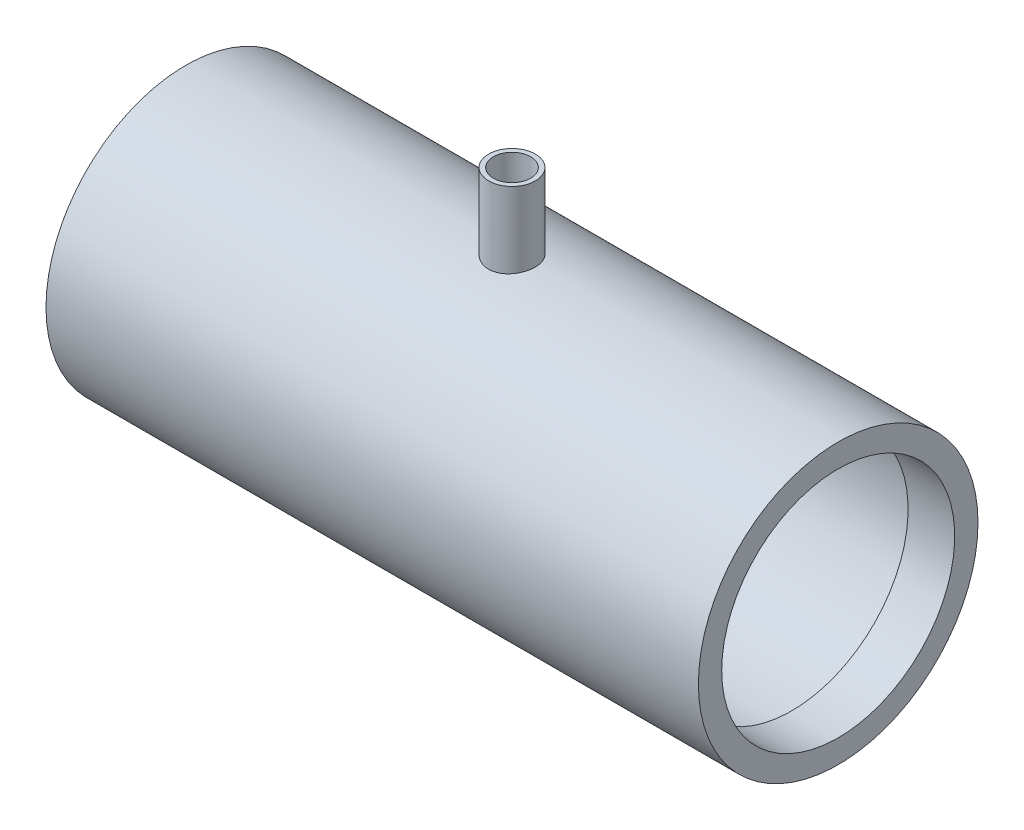
ISO-10303-21;
HEADER;
FILE_DESCRIPTION(('STEP AP214'),'2;1');
FILE_NAME('part.step','',(''),(''),'','','');
FILE_SCHEMA(('AUTOMOTIVE_DESIGN { 1 0 10303 214 1 1 1 1 }'));
ENDSEC;
DATA;
#1=APPLICATION_CONTEXT('core data for automotive mechanical design processes');
#2=APPLICATION_PROTOCOL_DEFINITION('international standard','automotive_design',2000,#1);
#3=PRODUCT_CONTEXT('',#1,'mechanical');
#4=PRODUCT('Part','Part','',(#3));
#5=PRODUCT_RELATED_PRODUCT_CATEGORY('part','',(#4));
#6=PRODUCT_DEFINITION_FORMATION('','',#4);
#7=PRODUCT_DEFINITION_CONTEXT('part definition',#1,'design');
#8=PRODUCT_DEFINITION('design','',#6,#7);
#9=PRODUCT_DEFINITION_SHAPE('','',#8);
#10=(LENGTH_UNIT() NAMED_UNIT(*) SI_UNIT(.MILLI.,.METRE.));
#11=(NAMED_UNIT(*) PLANE_ANGLE_UNIT() SI_UNIT($,.RADIAN.));
#12=(NAMED_UNIT(*) SI_UNIT($,.STERADIAN.) SOLID_ANGLE_UNIT());
#13=UNCERTAINTY_MEASURE_WITH_UNIT(LENGTH_MEASURE(1.E-05),#10,'distance_accuracy_value','');
#14=(GEOMETRIC_REPRESENTATION_CONTEXT(3) GLOBAL_UNCERTAINTY_ASSIGNED_CONTEXT((#13)) GLOBAL_UNIT_ASSIGNED_CONTEXT((#10,
#11,#12)) REPRESENTATION_CONTEXT('',''));
#15=CARTESIAN_POINT('',(0.,0.,0.));
#16=DIRECTION('',(0.,0.,1.));
#17=DIRECTION('',(1.,0.,0.));
#18=AXIS2_PLACEMENT_3D('',#15,#16,#17);
#19=CARTESIAN_POINT('',(0.,35.,0.));
#20=DIRECTION('',(0.,-1.,0.));
#21=DIRECTION('',(0.,0.,-1.));
#22=AXIS2_PLACEMENT_3D('',#19,#20,#21);
#23=CYLINDRICAL_SURFACE('',#22,2.);
#24=CARTESIAN_POINT('',(0.,23.,0.));
#25=DIRECTION('',(0.,1.,0.));
#26=DIRECTION('',(0.,0.,1.));
#27=AXIS2_PLACEMENT_3D('',#24,#25,#26);
#28=CIRCLE('',#27,2.);
#29=CARTESIAN_POINT('',(0.,23.,2.));
#30=VERTEX_POINT('',#29);
#31=EDGE_CURVE('E118',#30,#30,#28,.F.);
#32=ORIENTED_EDGE('',*,*,#31,.F.);
#33=EDGE_LOOP('',(#32));
#34=FACE_BOUND('',#33,.T.);
#35=CARTESIAN_POINT('',(0.,13.856406460551,-2.));
#36=CARTESIAN_POINT('',(0.111724171239718,13.8564082571265,-1.99999534115949));
#37=CARTESIAN_POINT('',(0.223514712772157,13.8577723197261,-1.99060664506871));
#38=CARTESIAN_POINT('',(0.4439746364233,13.8630779913067,-1.95330740137887));
#39=CARTESIAN_POINT('',(0.552640795515153,13.8670221688303,-1.92537839621705));
#40=CARTESIAN_POINT('',(0.763628700028854,13.8770324264324,-1.85184738836467));
#41=CARTESIAN_POINT('',(0.865955078100517,13.8830969350759,-1.80625847122079));
#42=CARTESIAN_POINT('',(1.06148972946806,13.8966626659811,-1.69873175889211));
#43=CARTESIAN_POINT('',(1.15469934704029,13.9041636759451,-1.63679637900725));
#44=CARTESIAN_POINT('',(1.33004829584733,13.9198182525555,-1.49785346840196));
#45=CARTESIAN_POINT('',(1.41211171386589,13.9279757447273,-1.42075056427329));
#46=CARTESIAN_POINT('',(1.56218155724058,13.9439890311844,-1.25386707896715));
#47=CARTESIAN_POINT('',(1.63018723264027,13.9518448093556,-1.16408582185113));
#48=CARTESIAN_POINT('',(1.75048909775968,13.9664103702289,-0.973910384020492));
#49=CARTESIAN_POINT('',(1.80271571451843,13.9731150229347,-0.873471766216093));
#50=CARTESIAN_POINT('',(1.88953073532782,13.9845795145291,-0.665136745963097));
#51=CARTESIAN_POINT('',(1.92411998664739,13.9893394468365,-0.55724070203933));
#52=CARTESIAN_POINT('',(1.97444920696427,13.9963505000898,-0.337834063540951));
#53=CARTESIAN_POINT('',(1.99031606996624,13.9986185031811,-0.226353125069878));
#54=CARTESIAN_POINT('',(2.0031438985666,14.0004479548383,-0.00228956527839937));
#55=CARTESIAN_POINT('',(2.00010582196611,14.0000095405223,0.110292999940578));
#56=CARTESIAN_POINT('',(1.97531062178419,13.9964890946326,0.33249899218587));
#57=CARTESIAN_POINT('',(1.95369000111749,13.9934263413243,0.442137999771035));
#58=CARTESIAN_POINT('',(1.89255744030079,13.9850228541263,0.656215595128694));
#59=CARTESIAN_POINT('',(1.8530450750122,13.9796820661069,0.760654059261883));
#60=CARTESIAN_POINT('',(1.75710925521643,13.9672894037098,0.961781966767737));
#61=CARTESIAN_POINT('',(1.70062784888116,13.9602316817171,1.05844339279107));
#62=CARTESIAN_POINT('',(1.57239950725974,13.9451926669623,1.24096782013765));
#63=CARTESIAN_POINT('',(1.50065165935678,13.9372113189995,1.32683017541183));
#64=CARTESIAN_POINT('',(1.34316539832401,13.921132049438,1.48612299106386));
#65=CARTESIAN_POINT('',(1.25730786725081,13.9130337231123,1.55943569332184));
#66=CARTESIAN_POINT('',(1.07444547857052,13.8977029387566,1.69062989590123));
#67=CARTESIAN_POINT('',(0.977440563854387,13.8904704851631,1.74851131716179));
#68=CARTESIAN_POINT('',(0.774919710093822,13.8776905368292,1.84721301520795));
#69=CARTESIAN_POINT('',(0.669398194117397,13.8721441576987,1.88802200251778));
#70=CARTESIAN_POINT('',(0.452902420174113,13.8633846580895,1.9513062370832));
#71=CARTESIAN_POINT('',(0.341928509608439,13.8601713891613,1.97378265080303));
#72=CARTESIAN_POINT('',(0.118723462569961,13.8564698075732,1.99960390688194));
#73=CARTESIAN_POINT('',(0.00651197400441611,13.8559577720311,2.00311531104472));
#74=CARTESIAN_POINT('',(-0.216897805025151,13.8576537253271,1.99134808247121));
#75=CARTESIAN_POINT('',(-0.328096123823289,13.8598616378631,1.9760699768337));
#76=CARTESIAN_POINT('',(-0.545812180028447,13.8667269652516,1.92729837855201));
#77=CARTESIAN_POINT('',(-0.652348727065342,13.8713733134525,1.89388715844421));
#78=CARTESIAN_POINT('',(-0.858308797456497,13.8825829121217,1.80988306171463));
#79=CARTESIAN_POINT('',(-0.957731999561724,13.8891462490961,1.75928940970141));
#80=CARTESIAN_POINT('',(-1.14739187972149,13.9035064841342,1.64195360331226));
#81=CARTESIAN_POINT('',(-1.23756096121236,13.911311524523,1.57510320027125));
#82=CARTESIAN_POINT('',(-1.40545972362551,13.9272509086593,1.42730277821365));
#83=CARTESIAN_POINT('',(-1.48318876805913,13.9353852692295,1.34635203820216));
#84=CARTESIAN_POINT('',(-1.6245952184338,13.9511405241391,1.17191708628535));
#85=CARTESIAN_POINT('',(-1.68816252231952,13.9587570956185,1.07834317212433));
#86=CARTESIAN_POINT('',(-1.79867556313572,13.972552215598,0.881748704771193));
#87=CARTESIAN_POINT('',(-1.84562171973795,13.9787308004049,0.778728390176454));
#88=CARTESIAN_POINT('',(-1.92138211431572,13.9889347784444,0.566515924593931));
#89=CARTESIAN_POINT('',(-1.95025758862749,13.9929674365722,0.457345999123927));
#90=CARTESIAN_POINT('',(-1.98925546710661,13.9984555911653,0.235645259045784));
#91=CARTESIAN_POINT('',(-1.99937898985385,13.9999112413524,0.123114645314277));
#92=CARTESIAN_POINT('',(-2.00056023894447,14.0000800767192,-0.101043130627158));
#93=CARTESIAN_POINT('',(-1.99178681901844,13.998817550224,-0.212669421750584));
#94=CARTESIAN_POINT('',(-1.95578384995697,13.9937406427504,-0.432842633479872));
#95=CARTESIAN_POINT('',(-1.92855434439613,13.989926267797,-0.541389561355442));
#96=CARTESIAN_POINT('',(-1.85647002257181,13.9801722205426,-0.752283714497251));
#97=CARTESIAN_POINT('',(-1.81162581951526,13.9742338281967,-0.854634630206984));
#98=CARTESIAN_POINT('',(-1.70560285079797,13.9608856010229,-1.05038570585148));
#99=CARTESIAN_POINT('',(-1.64442365494189,13.9534757274438,-1.14378562996655));
#100=CARTESIAN_POINT('',(-1.50685228477663,13.9379304746346,-1.31984194960265));
#101=CARTESIAN_POINT('',(-1.4303350931675,13.9297894585903,-1.40240016631986));
#102=CARTESIAN_POINT('',(-1.2645224397647,13.9137422342621,-1.55356716727243));
#103=CARTESIAN_POINT('',(-1.17522397700347,13.9058360816507,-1.6221726663073));
#104=CARTESIAN_POINT('',(-0.985854561664355,13.8911108785174,-1.74379523475593));
#105=CARTESIAN_POINT('',(-0.885731309588877,13.8842975402726,-1.79673154300995));
#106=CARTESIAN_POINT('',(-0.67796770339548,13.8725962813595,-1.88495902507096));
#107=CARTESIAN_POINT('',(-0.57033540168281,13.8677063343816,-1.92026877922144));
#108=CARTESIAN_POINT('',(-0.385163574169462,13.8615529221772,-1.96409255165575));
#109=CARTESIAN_POINT('',(-0.308775664589437,13.859633039894,-1.97753762529532));
#110=CARTESIAN_POINT('',(-0.154935803034168,13.857059193163,-1.99549291508544));
#111=CARTESIAN_POINT('',(-0.0774838629538774,13.8564052145753,-2.00000323103726));
#112=CARTESIAN_POINT('',(0.,13.856406460551,-2.));
#113=B_SPLINE_CURVE_WITH_KNOTS('',3,(#35,#36,#37,#38,#39,#40,#41,#42,#43,#44,#45,#46,#47,#48,
#49,#50,#51,#52,#53,#54,#55,#56,#57,#58,#59,#60,#61,#62,#63,#64,#65,#66,#67,#68,#69,#70,#71,#72,
#73,#74,#75,#76,#77,#78,#79,#80,#81,#82,#83,#84,#85,#86,#87,#88,#89,#90,#91,#92,#93,#94,#95,#96,
#97,#98,#99,#100,#101,#102,#103,#104,#105,#106,#107,#108,#109,#110,#111,#112),.UNSPECIFIED.,.T.,
.F.,(4,2,2,2,2,2,2,2,2,2,2,2,2,2,2,2,2,2,2,2,2,2,2,2,2,2,2,2,2,2,2,2,2,2,2,2,2,2,4),(0.,
0.334889349408973,0.670112594526281,1.00508792139358,1.34001378108308,1.67711715649019,
2.01423851114537,2.35282530676003,2.6913958357102,3.02765822138618,3.36390357078099,
3.69769984907442,4.03150405935711,4.36646147641386,4.70143892261039,5.03940517986243,
5.37737316862278,5.7155642933107,6.05373389790875,6.3889286108256,6.72411392079906,
7.05779100804299,7.39148315513125,7.72746121011463,8.06345644976601,8.40197921522166,
8.74049343261658,9.07785422138908,9.41519488547502,9.74953375304065,10.083871831239,
10.4180087723112,10.7521545140199,11.0891434930866,11.426211725383,11.7649881551453,
12.103406718889,12.3356645196522,12.5679197260806),.UNSPECIFIED.);
#114=CARTESIAN_POINT('',(0.,13.856406460551,-2.));
#115=VERTEX_POINT('',#114);
#116=EDGE_CURVE('E44',#115,#115,#113,.T.);
#117=ORIENTED_EDGE('',*,*,#116,.T.);
#118=EDGE_LOOP('',(#117));
#119=FACE_BOUND('',#118,.T.);
#120=ADVANCED_FACE('F39',(#34,#119),#23,.F.);
#121=CARTESIAN_POINT('',(30.,0.,0.));
#122=DIRECTION('',(-1.,0.,0.));
#123=DIRECTION('',(0.,0.,1.));
#124=AXIS2_PLACEMENT_3D('',#121,#122,#123);
#125=CYLINDRICAL_SURFACE('',#124,15.);
#126=CARTESIAN_POINT('',(-35.,0.,0.));
#127=DIRECTION('',(-1.,0.,0.));
#128=DIRECTION('',(0.,0.,1.));
#129=AXIS2_PLACEMENT_3D('',#126,#127,#128);
#130=CIRCLE('',#129,15.);
#131=CARTESIAN_POINT('',(-35.,0.,15.));
#132=VERTEX_POINT('',#131);
#133=EDGE_CURVE('E58',#132,#132,#130,.T.);
#134=ORIENTED_EDGE('',*,*,#133,.F.);
#135=EDGE_LOOP('',(#134));
#136=FACE_BOUND('',#135,.T.);
#137=CARTESIAN_POINT('',(35.,0.,0.));
#138=DIRECTION('',(-1.,0.,0.));
#139=DIRECTION('',(0.,0.,1.));
#140=AXIS2_PLACEMENT_3D('',#137,#138,#139);
#141=CIRCLE('',#140,15.);
#142=CARTESIAN_POINT('',(35.,0.,15.));
#143=VERTEX_POINT('',#142);
#144=EDGE_CURVE('E129',#143,#143,#141,.T.);
#145=ORIENTED_EDGE('',*,*,#144,.T.);
#146=EDGE_LOOP('',(#145));
#147=FACE_BOUND('',#146,.T.);
#148=CARTESIAN_POINT('',(0.,14.790199457749,-2.5));
#149=CARTESIAN_POINT('',(-0.139375748161812,14.790201973666,-2.49999439841983));
#150=CARTESIAN_POINT('',(-0.278827606071472,14.7921909238523,-2.48830516902828));
#151=CARTESIAN_POINT('',(-0.553818543263169,14.7999245720004,-2.44187742806638));
#152=CARTESIAN_POINT('',(-0.689353893758065,14.8056727334637,-2.40711766030861));
#153=CARTESIAN_POINT('',(-0.952492283341606,14.8202560936731,-2.31562954367049));
#154=CARTESIAN_POINT('',(-1.08010184866225,14.8290887118401,-2.25891955493199));
#155=CARTESIAN_POINT('',(-1.32398095471777,14.8488427210228,-2.12518649688947));
#156=CARTESIAN_POINT('',(-1.44025176957733,14.8597638769423,-2.04816571350133));
#157=CARTESIAN_POINT('',(-1.65931284974456,14.8825847115588,-1.87518752696654));
#158=CARTESIAN_POINT('',(-1.76197513138622,14.8944921732795,-1.77906904893234));
#159=CARTESIAN_POINT('',(-1.94979330686181,14.9178748066858,-1.57097200469527));
#160=CARTESIAN_POINT('',(-2.03494816311542,14.9293499527174,-1.45899249914997));
#161=CARTESIAN_POINT('',(-2.18581456721927,14.9506573698271,-1.22152286994836));
#162=CARTESIAN_POINT('',(-2.2514070077318,14.9604794243234,-1.09595608145671));
#163=CARTESIAN_POINT('',(-2.36052107053055,14.9772873695709,-0.835395621723869));
#164=CARTESIAN_POINT('',(-2.40404412788488,14.9842734447266,-0.700402564078188));
#165=CARTESIAN_POINT('',(-2.4673925349839,14.994567347244,-0.426143726344243));
#166=CARTESIAN_POINT('',(-2.48743291600469,14.9979085311091,-0.286928886679271));
#167=CARTESIAN_POINT('',(-2.5039157541526,15.0006507934278,-0.00707528552579745));
#168=CARTESIAN_POINT('',(-2.50035981524723,15.0000521396931,0.133563378528898));
#169=CARTESIAN_POINT('',(-2.46991864847179,14.9950085843139,0.410802185078876));
#170=CARTESIAN_POINT('',(-2.44326483659085,14.990601836924,0.547428530700141));
#171=CARTESIAN_POINT('',(-2.36774892575351,14.9784797877164,0.814241979611791));
#172=CARTESIAN_POINT('',(-2.3188861504105,14.9707643851321,0.944428886651504));
#173=CARTESIAN_POINT('',(-2.20010935968468,14.9528269851196,1.19535614778265));
#174=CARTESIAN_POINT('',(-2.13009998791756,14.9425936732688,1.31605052301904));
#175=CARTESIAN_POINT('',(-1.97108717736495,14.920757380715,1.54406552984664));
#176=CARTESIAN_POINT('',(-1.88208220128918,14.9091542891913,1.65138507791588));
#177=CARTESIAN_POINT('',(-1.68632119338069,14.885702682326,1.85097127344667));
#178=CARTESIAN_POINT('',(-1.57936290509902,14.8738528973104,1.94303950225321));
#179=CARTESIAN_POINT('',(-1.35141290978418,14.8513795978481,2.10795458844807));
#180=CARTESIAN_POINT('',(-1.23042107331718,14.8407560947132,2.18080126853242));
#181=CARTESIAN_POINT('',(-0.97760835812252,14.8219375456182,2.30524443448829));
#182=CARTESIAN_POINT('',(-0.845775501907909,14.813745233026,2.35681702727924));
#183=CARTESIAN_POINT('',(-0.575150927692456,14.8007618868988,2.43702987081562));
#184=CARTESIAN_POINT('',(-0.436359823567576,14.7959705538832,2.46567214076796));
#185=CARTESIAN_POINT('',(-0.157533843837868,14.7903895942212,2.49893188487927));
#186=CARTESIAN_POINT('',(-0.017533620297898,14.7895528575867,2.50383220791244));
#187=CARTESIAN_POINT('',(0.26128667169082,14.7918503478236,2.49022270268246));
#188=CARTESIAN_POINT('',(0.400106785513972,14.7949844213185,2.47171377862467));
#189=CARTESIAN_POINT('',(0.671727759190858,14.8048268745502,2.4120523349281));
#190=CARTESIAN_POINT('',(0.80456113987801,14.8115125191835,2.37104379064639));
#191=CARTESIAN_POINT('',(1.06147016627949,14.827685730055,2.26769819019228));
#192=CARTESIAN_POINT('',(1.1855452875509,14.8371734639058,2.20535985810094));
#193=CARTESIAN_POINT('',(1.42267459440611,14.8579912839739,2.06045667322923));
#194=CARTESIAN_POINT('',(1.53561657275606,14.8693375560035,1.97771056415936));
#195=CARTESIAN_POINT('',(1.746113532695,14.8925466667987,1.79458946570798));
#196=CARTESIAN_POINT('',(1.84366743110974,14.9044095418533,1.69421323638404));
#197=CARTESIAN_POINT('',(2.0216518927287,14.9274642211826,1.47742807032881));
#198=CARTESIAN_POINT('',(2.10189382628454,14.9386477634467,1.3608632533862));
#199=CARTESIAN_POINT('',(2.24165532700488,14.9589511243294,1.11574344794933));
#200=CARTESIAN_POINT('',(2.30117556447385,14.9680710096998,0.987188847470626));
#201=CARTESIAN_POINT('',(2.39751058395487,14.9831835816958,0.722299051501327));
#202=CARTESIAN_POINT('',(2.43442407573492,14.9891898456762,0.58600056260261));
#203=CARTESIAN_POINT('',(2.48481559896383,14.9974558316928,0.30903073487421));
#204=CARTESIAN_POINT('',(2.49829555873235,14.9997158620019,0.168359756821619));
#205=CARTESIAN_POINT('',(2.5013818823122,15.0002303788781,-0.111541275773678));
#206=CARTESIAN_POINT('',(2.49127525394108,14.9985330202419,-0.250768160602666));
#207=CARTESIAN_POINT('',(2.44809607773057,14.9914217838733,-0.525511974314706));
#208=CARTESIAN_POINT('',(2.41502365849033,14.9860079269518,-0.66102892396748));
#209=CARTESIAN_POINT('',(2.32696183445635,14.972069888274,-0.924396445918537));
#210=CARTESIAN_POINT('',(2.27199683178995,14.9635491704088,-1.05225537215382));
#211=CARTESIAN_POINT('',(2.14174206376942,14.9443275687803,-1.29698045298217));
#212=CARTESIAN_POINT('',(2.06645133493755,14.9336265816741,-1.41384608611822));
#213=CARTESIAN_POINT('',(1.8966649075395,14.9110762961641,-1.6347129455264));
#214=CARTESIAN_POINT('',(1.80195904524874,14.8992152454112,-1.73855143060275));
#215=CARTESIAN_POINT('',(1.59647169209619,14.8757630331437,-1.92896387595091));
#216=CARTESIAN_POINT('',(1.48568644108747,14.8641719354951,-2.0155337867119));
#217=CARTESIAN_POINT('',(1.25025467751038,14.8424834353391,-2.16951427091086));
#218=CARTESIAN_POINT('',(1.12551566023451,14.8323971784578,-2.2367849890577));
#219=CARTESIAN_POINT('',(0.866390764161853,14.8149921009131,-2.34931453640427));
#220=CARTESIAN_POINT('',(0.732014677322635,14.8076705172488,-2.39459535522307));
#221=CARTESIAN_POINT('',(0.497596230512616,14.7982474485649,-2.45202605312742));
#222=CARTESIAN_POINT('',(0.398973192037393,14.7952462341947,-2.46998741767139));
#223=CARTESIAN_POINT('',(0.200246515163063,14.7912213528807,-2.49397629518131));
#224=CARTESIAN_POINT('',(0.100142903675801,14.7901976500369,-2.50000402479277));
#225=CARTESIAN_POINT('',(0.,14.790199457749,-2.5));
#226=B_SPLINE_CURVE_WITH_KNOTS('',3,(#148,#149,#150,#151,#152,#153,#154,#155,#156,#157,#158,
#159,#160,#161,#162,#163,#164,#165,#166,#167,#168,#169,#170,#171,#172,#173,#174,#175,#176,#177,
#178,#179,#180,#181,#182,#183,#184,#185,#186,#187,#188,#189,#190,#191,#192,#193,#194,#195,#196,
#197,#198,#199,#200,#201,#202,#203,#204,#205,#206,#207,#208,#209,#210,#211,#212,#213,#214,#215,
#216,#217,#218,#219,#220,#221,#222,#223,#224,#225),.UNSPECIFIED.,.T.,.F.,(4,2,2,2,2,2,2,2,2,2,2,
2,2,2,2,2,2,2,2,2,2,2,2,2,2,2,2,2,2,2,2,2,2,2,2,2,2,2,4),(0.,0.41776103892774,0.83590751996297,
1.25370499787519,1.67145547405274,2.09289159155715,2.51435267834447,2.93832980111435,
3.36227935111113,3.78231567472565,4.20232344652692,4.61817121164668,5.03403164249533,
5.45179604139425,5.86959426226764,6.29246123462124,6.71533210746019,7.13867662498604,
7.56198385938077,7.98023542420411,8.39847083413976,8.81406064635492,9.22967532293575,
9.64912342762702,10.0686010443069,10.4924411303538,10.916267504767,11.3382298441765,
11.7601574591235,12.1769777626592,12.5937957321882,13.0101503983246,13.4265248039234,
13.8476699746325,14.2689137888181,14.6931372761832,15.1169356674445,15.4171067054376,
15.7172722940182),.UNSPECIFIED.);
#227=CARTESIAN_POINT('',(0.,14.790199457749,-2.5));
#228=VERTEX_POINT('',#227);
#229=EDGE_CURVE('E10',#228,#228,#226,.T.);
#230=ORIENTED_EDGE('',*,*,#229,.F.);
#231=EDGE_LOOP('',(#230));
#232=FACE_BOUND('',#231,.T.);
#233=ADVANCED_FACE('F41',(#136,#147,#232),#125,.T.);
#234=CARTESIAN_POINT('',(30.,0.,0.));
#235=DIRECTION('',(-1.,0.,0.));
#236=DIRECTION('',(0.,0.,1.));
#237=AXIS2_PLACEMENT_3D('',#234,#235,#236);
#238=CYLINDRICAL_SURFACE('',#237,14.);
#239=CARTESIAN_POINT('',(30.,0.,0.));
#240=DIRECTION('',(1.,0.,0.));
#241=DIRECTION('',(0.,0.,-1.));
#242=AXIS2_PLACEMENT_3D('',#239,#240,#241);
#243=CIRCLE('',#242,14.);
#244=CARTESIAN_POINT('',(30.,0.,-14.));
#245=VERTEX_POINT('',#244);
#246=EDGE_CURVE('E126',#245,#245,#243,.T.);
#247=ORIENTED_EDGE('',*,*,#246,.T.);
#248=EDGE_LOOP('',(#247));
#249=FACE_BOUND('',#248,.T.);
#250=CARTESIAN_POINT('',(-30.,0.,0.));
#251=DIRECTION('',(1.,0.,0.));
#252=DIRECTION('',(0.,0.,-1.));
#253=AXIS2_PLACEMENT_3D('',#250,#251,#252);
#254=CIRCLE('',#253,14.);
#255=CARTESIAN_POINT('',(-30.,0.,-14.));
#256=VERTEX_POINT('',#255);
#257=EDGE_CURVE('E53',#256,#256,#254,.T.);
#258=ORIENTED_EDGE('',*,*,#257,.F.);
#259=EDGE_LOOP('',(#258));
#260=FACE_BOUND('',#259,.T.);
#261=ORIENTED_EDGE('',*,*,#116,.F.);
#262=EDGE_LOOP('',(#261));
#263=FACE_BOUND('',#262,.T.);
#264=ADVANCED_FACE('F98',(#249,#260,#263),#238,.F.);
#265=CARTESIAN_POINT('',(-30.,0.,0.));
#266=DIRECTION('',(-1.,0.,0.));
#267=DIRECTION('',(0.,0.,1.));
#268=AXIS2_PLACEMENT_3D('',#265,#266,#267);
#269=PLANE('',#268);
#270=CARTESIAN_POINT('',(-30.,0.,0.));
#271=DIRECTION('',(-1.,0.,0.));
#272=DIRECTION('',(0.,0.,1.));
#273=AXIS2_PLACEMENT_3D('',#270,#271,#272);
#274=CIRCLE('',#273,12.5);
#275=CARTESIAN_POINT('',(-30.,0.,12.5));
#276=VERTEX_POINT('',#275);
#277=EDGE_CURVE('E128',#276,#276,#274,.T.);
#278=ORIENTED_EDGE('',*,*,#277,.T.);
#279=EDGE_LOOP('',(#278));
#280=FACE_BOUND('',#279,.T.);
#281=ORIENTED_EDGE('',*,*,#257,.T.);
#282=EDGE_LOOP('',(#281));
#283=FACE_BOUND('',#282,.T.);
#284=ADVANCED_FACE('F95',(#280,#283),#269,.F.);
#285=CARTESIAN_POINT('',(-35.,0.,0.));
#286=DIRECTION('',(-1.,0.,0.));
#287=DIRECTION('',(0.,0.,1.));
#288=AXIS2_PLACEMENT_3D('',#285,#286,#287);
#289=PLANE('',#288);
#290=ORIENTED_EDGE('',*,*,#133,.T.);
#291=EDGE_LOOP('',(#290));
#292=FACE_BOUND('',#291,.T.);
#293=CARTESIAN_POINT('',(-35.,0.,0.));
#294=DIRECTION('',(-1.,0.,0.));
#295=DIRECTION('',(0.,0.,1.));
#296=AXIS2_PLACEMENT_3D('',#293,#294,#295);
#297=CIRCLE('',#296,12.5);
#298=CARTESIAN_POINT('',(-35.,0.,12.5));
#299=VERTEX_POINT('',#298);
#300=EDGE_CURVE('E132',#299,#299,#297,.T.);
#301=ORIENTED_EDGE('',*,*,#300,.F.);
#302=EDGE_LOOP('',(#301));
#303=FACE_BOUND('',#302,.T.);
#304=ADVANCED_FACE('F91',(#292,#303),#289,.T.);
#305=CARTESIAN_POINT('',(-35.,0.,0.));
#306=DIRECTION('',(1.,0.,0.));
#307=DIRECTION('',(0.,0.,-1.));
#308=AXIS2_PLACEMENT_3D('',#305,#306,#307);
#309=CYLINDRICAL_SURFACE('',#308,12.5);
#310=ORIENTED_EDGE('',*,*,#300,.T.);
#311=EDGE_LOOP('',(#310));
#312=FACE_BOUND('',#311,.T.);
#313=ORIENTED_EDGE('',*,*,#277,.F.);
#314=EDGE_LOOP('',(#313));
#315=FACE_BOUND('',#314,.T.);
#316=ADVANCED_FACE('F87',(#312,#315),#309,.F.);
#317=CARTESIAN_POINT('',(30.,0.,0.));
#318=DIRECTION('',(1.,0.,0.));
#319=DIRECTION('',(0.,0.,1.));
#320=AXIS2_PLACEMENT_3D('',#317,#318,#319);
#321=PLANE('',#320);
#322=CARTESIAN_POINT('',(30.,0.,0.));
#323=DIRECTION('',(-1.,0.,0.));
#324=DIRECTION('',(0.,0.,1.));
#325=AXIS2_PLACEMENT_3D('',#322,#323,#324);
#326=CIRCLE('',#325,12.5);
#327=CARTESIAN_POINT('',(30.,0.,12.5));
#328=VERTEX_POINT('',#327);
#329=EDGE_CURVE('E124',#328,#328,#326,.T.);
#330=ORIENTED_EDGE('',*,*,#329,.F.);
#331=EDGE_LOOP('',(#330));
#332=FACE_BOUND('',#331,.T.);
#333=ORIENTED_EDGE('',*,*,#246,.F.);
#334=EDGE_LOOP('',(#333));
#335=FACE_BOUND('',#334,.T.);
#336=ADVANCED_FACE('F83',(#332,#335),#321,.F.);
#337=CARTESIAN_POINT('',(35.,0.,0.));
#338=DIRECTION('',(1.,0.,0.));
#339=DIRECTION('',(0.,0.,1.));
#340=AXIS2_PLACEMENT_3D('',#337,#338,#339);
#341=PLANE('',#340);
#342=CARTESIAN_POINT('',(35.,0.,0.));
#343=DIRECTION('',(-1.,0.,0.));
#344=DIRECTION('',(0.,0.,1.));
#345=AXIS2_PLACEMENT_3D('',#342,#343,#344);
#346=CIRCLE('',#345,12.5);
#347=CARTESIAN_POINT('',(35.,0.,12.5));
#348=VERTEX_POINT('',#347);
#349=EDGE_CURVE('E67',#348,#348,#346,.T.);
#350=ORIENTED_EDGE('',*,*,#349,.T.);
#351=EDGE_LOOP('',(#350));
#352=FACE_BOUND('',#351,.T.);
#353=ORIENTED_EDGE('',*,*,#144,.F.);
#354=EDGE_LOOP('',(#353));
#355=FACE_BOUND('',#354,.T.);
#356=ADVANCED_FACE('F79',(#352,#355),#341,.T.);
#357=CARTESIAN_POINT('',(35.,0.,0.));
#358=DIRECTION('',(-1.,0.,0.));
#359=DIRECTION('',(0.,0.,1.));
#360=AXIS2_PLACEMENT_3D('',#357,#358,#359);
#361=CYLINDRICAL_SURFACE('',#360,12.5);
#362=ORIENTED_EDGE('',*,*,#349,.F.);
#363=EDGE_LOOP('',(#362));
#364=FACE_BOUND('',#363,.T.);
#365=ORIENTED_EDGE('',*,*,#329,.T.);
#366=EDGE_LOOP('',(#365));
#367=FACE_BOUND('',#366,.T.);
#368=ADVANCED_FACE('F75',(#364,#367),#361,.F.);
#369=CARTESIAN_POINT('',(0.,23.,0.));
#370=DIRECTION('',(0.,-1.,0.));
#371=DIRECTION('',(0.,0.,-1.));
#372=AXIS2_PLACEMENT_3D('',#369,#370,#371);
#373=CYLINDRICAL_SURFACE('',#372,2.5);
#374=CARTESIAN_POINT('',(0.,23.,0.));
#375=DIRECTION('',(0.,1.,0.));
#376=DIRECTION('',(0.,0.,1.));
#377=AXIS2_PLACEMENT_3D('',#374,#375,#376);
#378=CIRCLE('',#377,2.5);
#379=CARTESIAN_POINT('',(0.,23.,2.5));
#380=VERTEX_POINT('',#379);
#381=EDGE_CURVE('E66',#380,#380,#378,.T.);
#382=ORIENTED_EDGE('',*,*,#381,.F.);
#383=EDGE_LOOP('',(#382));
#384=FACE_BOUND('',#383,.T.);
#385=ORIENTED_EDGE('',*,*,#229,.T.);
#386=EDGE_LOOP('',(#385));
#387=FACE_BOUND('',#386,.T.);
#388=ADVANCED_FACE('F69',(#384,#387),#373,.T.);
#389=CARTESIAN_POINT('',(0.,23.,0.));
#390=DIRECTION('',(0.,1.,0.));
#391=DIRECTION('',(0.,0.,1.));
#392=AXIS2_PLACEMENT_3D('',#389,#390,#391);
#393=PLANE('',#392);
#394=ORIENTED_EDGE('',*,*,#31,.T.);
#395=EDGE_LOOP('',(#394));
#396=FACE_BOUND('',#395,.T.);
#397=ORIENTED_EDGE('',*,*,#381,.T.);
#398=EDGE_LOOP('',(#397));
#399=FACE_BOUND('',#398,.T.);
#400=ADVANCED_FACE('F74',(#396,#399),#393,.T.);
#401=CLOSED_SHELL('',(#120,#233,#264,#284,#304,#316,#336,#356,#368,#388,#400));
#402=MANIFOLD_SOLID_BREP('B2',#401);
#403=ADVANCED_BREP_SHAPE_REPRESENTATION('',(#18,#402),#14);
#404=SHAPE_DEFINITION_REPRESENTATION(#9,#403);
ENDSEC;
END-ISO-10303-21;
